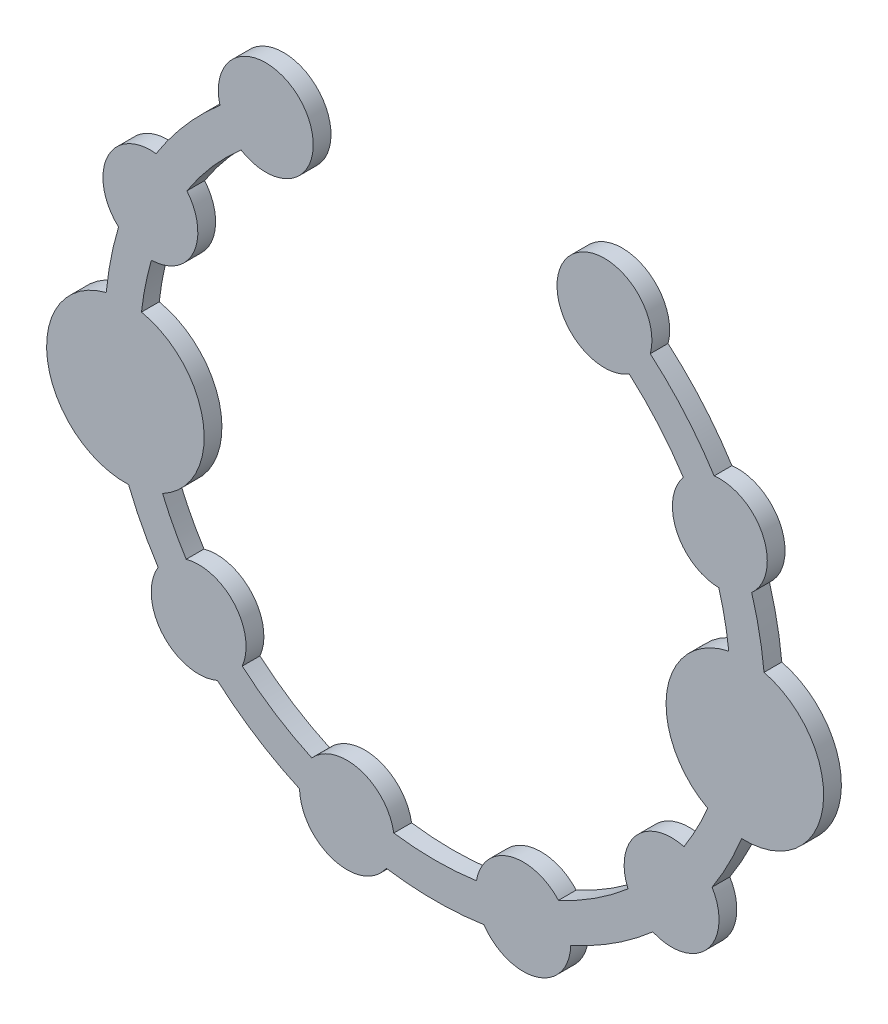
ISO-10303-21;
HEADER;
FILE_DESCRIPTION(('STEP AP214'),'2;1');
FILE_NAME('part.step','',(''),(''),'','','');
FILE_SCHEMA(('AUTOMOTIVE_DESIGN { 1 0 10303 214 1 1 1 1 }'));
ENDSEC;
DATA;
#1=APPLICATION_CONTEXT('core data for automotive mechanical design processes');
#2=APPLICATION_PROTOCOL_DEFINITION('international standard','automotive_design',2000,#1);
#3=PRODUCT_CONTEXT('',#1,'mechanical');
#4=PRODUCT('Part','Part','',(#3));
#5=PRODUCT_RELATED_PRODUCT_CATEGORY('part','',(#4));
#6=PRODUCT_DEFINITION_FORMATION('','',#4);
#7=PRODUCT_DEFINITION_CONTEXT('part definition',#1,'design');
#8=PRODUCT_DEFINITION('design','',#6,#7);
#9=PRODUCT_DEFINITION_SHAPE('','',#8);
#10=(LENGTH_UNIT() NAMED_UNIT(*) SI_UNIT(.MILLI.,.METRE.));
#11=(NAMED_UNIT(*) PLANE_ANGLE_UNIT() SI_UNIT($,.RADIAN.));
#12=(NAMED_UNIT(*) SI_UNIT($,.STERADIAN.) SOLID_ANGLE_UNIT());
#13=UNCERTAINTY_MEASURE_WITH_UNIT(LENGTH_MEASURE(1.E-05),#10,'distance_accuracy_value','');
#14=(GEOMETRIC_REPRESENTATION_CONTEXT(3) GLOBAL_UNCERTAINTY_ASSIGNED_CONTEXT((#13)) GLOBAL_UNIT_ASSIGNED_CONTEXT((#10,
#11,#12)) REPRESENTATION_CONTEXT('',''));
#15=CARTESIAN_POINT('',(0.,0.,0.));
#16=DIRECTION('',(0.,0.,1.));
#17=DIRECTION('',(1.,0.,0.));
#18=AXIS2_PLACEMENT_3D('',#15,#16,#17);
#19=CARTESIAN_POINT('',(0.,0.,0.));
#20=DIRECTION('',(0.,0.,1.));
#21=DIRECTION('',(1.,0.,0.));
#22=AXIS2_PLACEMENT_3D('',#19,#20,#21);
#23=CYLINDRICAL_SURFACE('',#22,33.75);
#24=DIRECTION('',(0.,0.,-1.));
#25=VECTOR('',#24,1.);
#26=CARTESIAN_POINT('',(28.3574490931425,18.3007535618026,1.015));
#27=LINE('',#26,#25);
#28=CARTESIAN_POINT('',(28.3574490931425,18.3007535618026,2.03));
#29=VERTEX_POINT('',#28);
#30=CARTESIAN_POINT('',(28.3574490931425,18.3007535618026,0.));
#31=VERTEX_POINT('',#30);
#32=EDGE_CURVE('E59',#29,#31,#27,.T.);
#33=ORIENTED_EDGE('',*,*,#32,.F.);
#34=CARTESIAN_POINT('',(0.,0.,2.03));
#35=DIRECTION('',(0.,0.,-1.));
#36=DIRECTION('',(-1.,0.,0.));
#37=AXIS2_PLACEMENT_3D('',#34,#35,#36);
#38=CIRCLE('',#37,33.75);
#39=CARTESIAN_POINT('',(22.1760107652679,25.4418365402092,2.03));
#40=VERTEX_POINT('',#39);
#41=EDGE_CURVE('E291',#40,#29,#38,.T.);
#42=ORIENTED_EDGE('',*,*,#41,.F.);
#43=DIRECTION('',(0.,0.,1.));
#44=VECTOR('',#43,1.);
#45=CARTESIAN_POINT('',(22.1760107652679,25.4418365402092,0.));
#46=LINE('',#45,#44);
#47=CARTESIAN_POINT('',(22.1760107652679,25.4418365402092,0.));
#48=VERTEX_POINT('',#47);
#49=EDGE_CURVE('E274',#48,#40,#46,.T.);
#50=ORIENTED_EDGE('',*,*,#49,.F.);
#51=CARTESIAN_POINT('',(0.,0.,0.));
#52=DIRECTION('',(0.,0.,-1.));
#53=DIRECTION('',(-1.,0.,0.));
#54=AXIS2_PLACEMENT_3D('',#51,#52,#53);
#55=CIRCLE('',#54,33.75);
#56=EDGE_CURVE('E283',#48,#31,#55,.T.);
#57=ORIENTED_EDGE('',*,*,#56,.T.);
#58=EDGE_LOOP('',(#33,#42,#50,#57));
#59=FACE_BOUND('',#58,.T.);
#60=ADVANCED_FACE('F36',(#59),#23,.F.);
#61=CARTESIAN_POINT('',(0.,0.,0.));
#62=DIRECTION('',(0.,0.,1.));
#63=DIRECTION('',(1.,0.,0.));
#64=AXIS2_PLACEMENT_3D('',#61,#62,#63);
#65=CYLINDRICAL_SURFACE('',#64,37.75);
#66=DIRECTION('',(0.,0.,-1.));
#67=VECTOR('',#66,1.);
#68=CARTESIAN_POINT('',(31.8794195866251,20.2179402219885,1.015));
#69=LINE('',#68,#67);
#70=CARTESIAN_POINT('',(31.8794195866251,20.2179402219885,0.));
#71=VERTEX_POINT('',#70);
#72=CARTESIAN_POINT('',(31.8794195866251,20.2179402219885,2.03));
#73=VERTEX_POINT('',#72);
#74=EDGE_CURVE('E514',#71,#73,#69,.F.);
#75=ORIENTED_EDGE('',*,*,#74,.F.);
#76=CARTESIAN_POINT('',(0.,0.,0.));
#77=DIRECTION('',(0.,0.,1.));
#78=DIRECTION('',(-1.,0.,0.));
#79=AXIS2_PLACEMENT_3D('',#76,#77,#78);
#80=CIRCLE('',#79,37.75);
#81=CARTESIAN_POINT('',(24.5781736222649,28.6526766881177,0.));
#82=VERTEX_POINT('',#81);
#83=EDGE_CURVE('E287',#71,#82,#80,.T.);
#84=ORIENTED_EDGE('',*,*,#83,.T.);
#85=DIRECTION('',(0.,0.,1.));
#86=VECTOR('',#85,1.);
#87=CARTESIAN_POINT('',(24.5781736222649,28.6526766881177,0.));
#88=LINE('',#87,#86);
#89=CARTESIAN_POINT('',(24.5781736222649,28.6526766881177,2.03));
#90=VERTEX_POINT('',#89);
#91=EDGE_CURVE('E277',#82,#90,#88,.T.);
#92=ORIENTED_EDGE('',*,*,#91,.T.);
#93=CARTESIAN_POINT('',(0.,0.,2.03));
#94=DIRECTION('',(0.,0.,1.));
#95=DIRECTION('',(-1.,0.,0.));
#96=AXIS2_PLACEMENT_3D('',#93,#94,#95);
#97=CIRCLE('',#96,37.75);
#98=EDGE_CURVE('E361',#73,#90,#97,.T.);
#99=ORIENTED_EDGE('',*,*,#98,.F.);
#100=EDGE_LOOP('',(#75,#84,#92,#99));
#101=FACE_BOUND('',#100,.T.);
#102=ADVANCED_FACE('F512',(#101),#65,.T.);
#103=DIRECTION('',(0.,0.,-1.));
#104=VECTOR('',#103,1.);
#105=CARTESIAN_POINT('',(28.4316785886476,-18.1852179704241,1.015));
#106=LINE('',#105,#104);
#107=CARTESIAN_POINT('',(28.4316785886476,-18.1852179704241,2.03));
#108=VERTEX_POINT('',#107);
#109=CARTESIAN_POINT('',(28.4316785886476,-18.1852179704241,0.));
#110=VERTEX_POINT('',#109);
#111=EDGE_CURVE('E469',#108,#110,#106,.T.);
#112=ORIENTED_EDGE('',*,*,#111,.F.);
#113=CARTESIAN_POINT('',(31.1327234183603,-13.0313480713195,2.03));
#114=VERTEX_POINT('',#113);
#115=EDGE_CURVE('E448',#114,#108,#38,.T.);
#116=ORIENTED_EDGE('',*,*,#115,.F.);
#117=DIRECTION('',(0.,0.,-1.));
#118=VECTOR('',#117,1.);
#119=CARTESIAN_POINT('',(31.1327234183603,-13.0313480713195,1.015));
#120=LINE('',#119,#118);
#121=CARTESIAN_POINT('',(31.1327234183603,-13.0313480713195,0.));
#122=VERTEX_POINT('',#121);
#123=EDGE_CURVE('E421',#122,#114,#120,.F.);
#124=ORIENTED_EDGE('',*,*,#123,.F.);
#125=EDGE_CURVE('E454',#122,#110,#55,.T.);
#126=ORIENTED_EDGE('',*,*,#125,.T.);
#127=EDGE_LOOP('',(#112,#116,#124,#126));
#128=FACE_BOUND('',#127,.T.);
#129=ADVANCED_FACE('F541',(#128),#23,.F.);
#130=DIRECTION('',(0.,0.,-1.));
#131=VECTOR('',#130,1.);
#132=CARTESIAN_POINT('',(31.6393033547216,-20.5916726670736,1.015));
#133=LINE('',#132,#131);
#134=CARTESIAN_POINT('',(31.6393033547216,-20.5916726670736,0.));
#135=VERTEX_POINT('',#134);
#136=CARTESIAN_POINT('',(31.6393033547216,-20.5916726670736,2.03));
#137=VERTEX_POINT('',#136);
#138=EDGE_CURVE('E507',#135,#137,#133,.F.);
#139=ORIENTED_EDGE('',*,*,#138,.F.);
#140=CARTESIAN_POINT('',(35.0212489647341,-14.0916507531982,0.));
#141=VERTEX_POINT('',#140);
#142=EDGE_CURVE('E506',#135,#141,#80,.T.);
#143=ORIENTED_EDGE('',*,*,#142,.T.);
#144=DIRECTION('',(0.,0.,-1.));
#145=VECTOR('',#144,1.);
#146=CARTESIAN_POINT('',(35.0212489647341,-14.0916507531982,1.015));
#147=LINE('',#146,#145);
#148=CARTESIAN_POINT('',(35.0212489647341,-14.0916507531982,2.03));
#149=VERTEX_POINT('',#148);
#150=EDGE_CURVE('E476',#149,#141,#147,.T.);
#151=ORIENTED_EDGE('',*,*,#150,.F.);
#152=EDGE_CURVE('E497',#137,#149,#97,.T.);
#153=ORIENTED_EDGE('',*,*,#152,.F.);
#154=EDGE_LOOP('',(#139,#143,#151,#153));
#155=FACE_BOUND('',#154,.T.);
#156=ADVANCED_FACE('F505',(#155),#65,.T.);
#157=DIRECTION('',(0.,0.,-1.));
#158=VECTOR('',#157,1.);
#159=CARTESIAN_POINT('',(32.4093475244958,9.41789217587783,1.015));
#160=LINE('',#159,#158);
#161=CARTESIAN_POINT('',(32.4093475244958,9.41789217587783,0.));
#162=VERTEX_POINT('',#161);
#163=CARTESIAN_POINT('',(32.4093475244958,9.41789217587785,2.03));
#164=VERTEX_POINT('',#163);
#165=EDGE_CURVE('E458',#162,#164,#160,.F.);
#166=ORIENTED_EDGE('',*,*,#165,.F.);
#167=CARTESIAN_POINT('',(33.5453464398064,3.71109582648645,0.));
#168=VERTEX_POINT('',#167);
#169=EDGE_CURVE('E288',#162,#168,#55,.T.);
#170=ORIENTED_EDGE('',*,*,#169,.T.);
#171=DIRECTION('',(0.,0.,-1.));
#172=VECTOR('',#171,1.);
#173=CARTESIAN_POINT('',(33.5453464398064,3.71109582648646,1.015));
#174=LINE('',#173,#172);
#175=CARTESIAN_POINT('',(33.5453464398064,3.71109582648645,2.03));
#176=VERTEX_POINT('',#175);
#177=EDGE_CURVE('E417',#176,#168,#174,.T.);
#178=ORIENTED_EDGE('',*,*,#177,.F.);
#179=EDGE_CURVE('E51',#164,#176,#38,.T.);
#180=ORIENTED_EDGE('',*,*,#179,.F.);
#181=EDGE_LOOP('',(#166,#170,#178,#180));
#182=FACE_BOUND('',#181,.T.);
#183=ADVANCED_FACE('F456',(#182),#23,.F.);
#184=DIRECTION('',(0.,0.,-1.));
#185=VECTOR('',#184,1.);
#186=CARTESIAN_POINT('',(36.1659087125497,10.8207923460126,1.015));
#187=LINE('',#186,#185);
#188=CARTESIAN_POINT('',(36.1659087125496,10.8207923460126,2.03));
#189=VERTEX_POINT('',#188);
#190=CARTESIAN_POINT('',(36.1659087125496,10.8207923460126,0.));
#191=VERTEX_POINT('',#190);
#192=EDGE_CURVE('E526',#189,#191,#187,.T.);
#193=ORIENTED_EDGE('',*,*,#192,.F.);
#194=CARTESIAN_POINT('',(37.5750307406949,3.63036703872107,2.03));
#195=VERTEX_POINT('',#194);
#196=EDGE_CURVE('E494',#195,#189,#97,.T.);
#197=ORIENTED_EDGE('',*,*,#196,.F.);
#198=DIRECTION('',(0.,0.,-1.));
#199=VECTOR('',#198,1.);
#200=CARTESIAN_POINT('',(37.5750307406949,3.63036703872105,1.015));
#201=LINE('',#200,#199);
#202=CARTESIAN_POINT('',(37.5750307406949,3.63036703872105,0.));
#203=VERTEX_POINT('',#202);
#204=EDGE_CURVE('E479',#203,#195,#201,.F.);
#205=ORIENTED_EDGE('',*,*,#204,.F.);
#206=EDGE_CURVE('E509',#203,#191,#80,.T.);
#207=ORIENTED_EDGE('',*,*,#206,.T.);
#208=EDGE_LOOP('',(#193,#197,#205,#207));
#209=FACE_BOUND('',#208,.T.);
#210=ADVANCED_FACE('F593',(#209),#65,.T.);
#211=DIRECTION('',(0.,0.,-1.));
#212=VECTOR('',#211,1.);
#213=CARTESIAN_POINT('',(22.0366357753982,-25.5626521257564,1.015));
#214=LINE('',#213,#212);
#215=CARTESIAN_POINT('',(22.0366357753982,-25.5626521257564,0.));
#216=VERTEX_POINT('',#215);
#217=CARTESIAN_POINT('',(22.0366357753982,-25.5626521257564,2.03));
#218=VERTEX_POINT('',#217);
#219=EDGE_CURVE('E451',#216,#218,#214,.F.);
#220=ORIENTED_EDGE('',*,*,#219,.F.);
#221=CARTESIAN_POINT('',(14.0904718331514,-30.6679165174155,0.));
#222=VERTEX_POINT('',#221);
#223=EDGE_CURVE('E450',#216,#222,#55,.T.);
#224=ORIENTED_EDGE('',*,*,#223,.T.);
#225=DIRECTION('',(0.,0.,-1.));
#226=VECTOR('',#225,1.);
#227=CARTESIAN_POINT('',(14.0904718331514,-30.6679165174155,1.015));
#228=LINE('',#227,#226);
#229=CARTESIAN_POINT('',(14.0904718331514,-30.6679165174155,2.03));
#230=VERTEX_POINT('',#229);
#231=EDGE_CURVE('E297',#230,#222,#228,.T.);
#232=ORIENTED_EDGE('',*,*,#231,.F.);
#233=EDGE_CURVE('E441',#218,#230,#38,.T.);
#234=ORIENTED_EDGE('',*,*,#233,.F.);
#235=EDGE_LOOP('',(#220,#224,#232,#234));
#236=FACE_BOUND('',#235,.T.);
#237=ADVANCED_FACE('F449',(#236),#23,.F.);
#238=DIRECTION('',(0.,0.,-1.));
#239=VECTOR('',#238,1.);
#240=CARTESIAN_POINT('',(24.8740100130373,-28.396234360762,1.015));
#241=LINE('',#240,#239);
#242=CARTESIAN_POINT('',(24.8740100130373,-28.396234360762,2.03));
#243=VERTEX_POINT('',#242);
#244=CARTESIAN_POINT('',(24.8740100130373,-28.396234360762,0.));
#245=VERTEX_POINT('',#244);
#246=EDGE_CURVE('E535',#243,#245,#241,.T.);
#247=ORIENTED_EDGE('',*,*,#246,.F.);
#248=CARTESIAN_POINT('',(15.4883469459396,-34.4263505019368,2.03));
#249=VERTEX_POINT('',#248);
#250=EDGE_CURVE('E504',#249,#243,#97,.T.);
#251=ORIENTED_EDGE('',*,*,#250,.F.);
#252=DIRECTION('',(0.,0.,-1.));
#253=VECTOR('',#252,1.);
#254=CARTESIAN_POINT('',(15.4883469459396,-34.4263505019368,1.015));
#255=LINE('',#254,#253);
#256=CARTESIAN_POINT('',(15.4883469459396,-34.4263505019368,0.));
#257=VERTEX_POINT('',#256);
#258=EDGE_CURVE('E11',#257,#249,#255,.F.);
#259=ORIENTED_EDGE('',*,*,#258,.F.);
#260=EDGE_CURVE('E414',#257,#245,#80,.T.);
#261=ORIENTED_EDGE('',*,*,#260,.T.);
#262=EDGE_LOOP('',(#247,#251,#259,#261));
#263=FACE_BOUND('',#262,.T.);
#264=ADVANCED_FACE('F596',(#263),#65,.T.);
#265=CARTESIAN_POINT('',(-36.1659087125496,10.8207923460126,2.03));
#266=VERTEX_POINT('',#265);
#267=CARTESIAN_POINT('',(-37.5750307406949,3.63036703872105,2.03));
#268=VERTEX_POINT('',#267);
#269=EDGE_CURVE('E367',#266,#268,#97,.T.);
#270=ORIENTED_EDGE('',*,*,#269,.F.);
#271=DIRECTION('',(0.,0.,-1.));
#272=VECTOR('',#271,1.);
#273=CARTESIAN_POINT('',(-36.1659087125497,10.8207923460126,1.015));
#274=LINE('',#273,#272);
#275=CARTESIAN_POINT('',(-36.1659087125497,10.8207923460126,0.));
#276=VERTEX_POINT('',#275);
#277=EDGE_CURVE('E319',#266,#276,#274,.T.);
#278=ORIENTED_EDGE('',*,*,#277,.T.);
#279=CARTESIAN_POINT('',(-37.5750307406949,3.63036703872105,0.));
#280=VERTEX_POINT('',#279);
#281=EDGE_CURVE('E358',#276,#280,#80,.T.);
#282=ORIENTED_EDGE('',*,*,#281,.T.);
#283=DIRECTION('',(0.,0.,-1.));
#284=VECTOR('',#283,1.);
#285=CARTESIAN_POINT('',(-37.5750307406949,3.63036703872105,1.015));
#286=LINE('',#285,#284);
#287=EDGE_CURVE('E348',#280,#268,#286,.F.);
#288=ORIENTED_EDGE('',*,*,#287,.T.);
#289=EDGE_LOOP('',(#270,#278,#282,#288));
#290=FACE_BOUND('',#289,.T.);
#291=ADVANCED_FACE('F584',(#290),#65,.T.);
#292=CARTESIAN_POINT('',(-24.5781736222649,28.6526766881177,0.));
#293=VERTEX_POINT('',#292);
#294=CARTESIAN_POINT('',(-31.8794195866251,20.2179402219885,0.));
#295=VERTEX_POINT('',#294);
#296=EDGE_CURVE('E355',#293,#295,#80,.T.);
#297=ORIENTED_EDGE('',*,*,#296,.T.);
#298=DIRECTION('',(0.,0.,-1.));
#299=VECTOR('',#298,1.);
#300=CARTESIAN_POINT('',(-31.8794195866251,20.2179402219885,1.015));
#301=LINE('',#300,#299);
#302=CARTESIAN_POINT('',(-31.8794195866251,20.2179402219885,2.03));
#303=VERTEX_POINT('',#302);
#304=EDGE_CURVE('E317',#295,#303,#301,.F.);
#305=ORIENTED_EDGE('',*,*,#304,.T.);
#306=CARTESIAN_POINT('',(-24.5781736222649,28.6526766881177,2.03));
#307=VERTEX_POINT('',#306);
#308=EDGE_CURVE('E363',#307,#303,#97,.T.);
#309=ORIENTED_EDGE('',*,*,#308,.F.);
#310=DIRECTION('',(0.,0.,1.));
#311=VECTOR('',#310,1.);
#312=CARTESIAN_POINT('',(-24.5781736222649,28.6526766881177,0.));
#313=LINE('',#312,#311);
#314=EDGE_CURVE('E369',#293,#307,#313,.T.);
#315=ORIENTED_EDGE('',*,*,#314,.F.);
#316=EDGE_LOOP('',(#297,#305,#309,#315));
#317=FACE_BOUND('',#316,.T.);
#318=ADVANCED_FACE('F641',(#317),#65,.T.);
#319=CARTESIAN_POINT('',(-33.5453464398064,3.71109582648646,0.));
#320=VERTEX_POINT('',#319);
#321=CARTESIAN_POINT('',(-32.4093475244958,9.41789217587785,0.));
#322=VERTEX_POINT('',#321);
#323=EDGE_CURVE('E559',#320,#322,#55,.T.);
#324=ORIENTED_EDGE('',*,*,#323,.T.);
#325=DIRECTION('',(0.,0.,-1.));
#326=VECTOR('',#325,1.);
#327=CARTESIAN_POINT('',(-32.4093475244958,9.41789217587783,1.015));
#328=LINE('',#327,#326);
#329=CARTESIAN_POINT('',(-32.4093475244958,9.41789217587785,2.03));
#330=VERTEX_POINT('',#329);
#331=EDGE_CURVE('E315',#322,#330,#328,.F.);
#332=ORIENTED_EDGE('',*,*,#331,.T.);
#333=CARTESIAN_POINT('',(-33.5453464398064,3.71109582648646,2.03));
#334=VERTEX_POINT('',#333);
#335=EDGE_CURVE('E544',#334,#330,#38,.T.);
#336=ORIENTED_EDGE('',*,*,#335,.F.);
#337=DIRECTION('',(0.,0.,-1.));
#338=VECTOR('',#337,1.);
#339=CARTESIAN_POINT('',(-33.5453464398064,3.71109582648646,1.015));
#340=LINE('',#339,#338);
#341=EDGE_CURVE('E390',#334,#320,#340,.T.);
#342=ORIENTED_EDGE('',*,*,#341,.T.);
#343=EDGE_LOOP('',(#324,#332,#336,#342));
#344=FACE_BOUND('',#343,.T.);
#345=ADVANCED_FACE('F558',(#344),#23,.F.);
#346=CARTESIAN_POINT('',(-28.3574490931425,18.3007535618026,2.03));
#347=VERTEX_POINT('',#346);
#348=CARTESIAN_POINT('',(-22.1760107652679,25.4418365402092,2.03));
#349=VERTEX_POINT('',#348);
#350=EDGE_CURVE('E353',#347,#349,#38,.T.);
#351=ORIENTED_EDGE('',*,*,#350,.F.);
#352=DIRECTION('',(0.,0.,-1.));
#353=VECTOR('',#352,1.);
#354=CARTESIAN_POINT('',(-28.3574490931425,18.3007535618026,1.015));
#355=LINE('',#354,#353);
#356=CARTESIAN_POINT('',(-28.3574490931425,18.3007535618026,0.));
#357=VERTEX_POINT('',#356);
#358=EDGE_CURVE('E312',#347,#357,#355,.T.);
#359=ORIENTED_EDGE('',*,*,#358,.T.);
#360=CARTESIAN_POINT('',(-22.1760107652679,25.4418365402092,0.));
#361=VERTEX_POINT('',#360);
#362=EDGE_CURVE('E366',#357,#361,#55,.T.);
#363=ORIENTED_EDGE('',*,*,#362,.T.);
#364=DIRECTION('',(0.,0.,1.));
#365=VECTOR('',#364,1.);
#366=CARTESIAN_POINT('',(-22.1760107652679,25.4418365402092,0.));
#367=LINE('',#366,#365);
#368=EDGE_CURVE('E357',#361,#349,#367,.T.);
#369=ORIENTED_EDGE('',*,*,#368,.T.);
#370=EDGE_LOOP('',(#351,#359,#363,#369));
#371=FACE_BOUND('',#370,.T.);
#372=ADVANCED_FACE('F567',(#371),#23,.F.);
#373=CARTESIAN_POINT('',(-24.8740100130373,-28.396234360762,2.03));
#374=VERTEX_POINT('',#373);
#375=CARTESIAN_POINT('',(-15.4883469459396,-34.4263505019368,2.03));
#376=VERTEX_POINT('',#375);
#377=EDGE_CURVE('E589',#374,#376,#97,.T.);
#378=ORIENTED_EDGE('',*,*,#377,.F.);
#379=DIRECTION('',(0.,0.,-1.));
#380=VECTOR('',#379,1.);
#381=CARTESIAN_POINT('',(-24.8740100130373,-28.396234360762,1.015));
#382=LINE('',#381,#380);
#383=CARTESIAN_POINT('',(-24.8740100130373,-28.396234360762,0.));
#384=VERTEX_POINT('',#383);
#385=EDGE_CURVE('E337',#374,#384,#382,.T.);
#386=ORIENTED_EDGE('',*,*,#385,.T.);
#387=CARTESIAN_POINT('',(-15.4883469459396,-34.4263505019368,0.));
#388=VERTEX_POINT('',#387);
#389=EDGE_CURVE('E651',#384,#388,#80,.T.);
#390=ORIENTED_EDGE('',*,*,#389,.T.);
#391=DIRECTION('',(0.,0.,1.));
#392=VECTOR('',#391,1.);
#393=CARTESIAN_POINT('',(-15.4883469459396,-34.4263505019368,1.015));
#394=LINE('',#393,#392);
#395=EDGE_CURVE('E372',#376,#388,#394,.F.);
#396=ORIENTED_EDGE('',*,*,#395,.F.);
#397=EDGE_LOOP('',(#378,#386,#390,#396));
#398=FACE_BOUND('',#397,.T.);
#399=ADVANCED_FACE('F633',(#398),#65,.T.);
#400=CARTESIAN_POINT('',(-35.0212489647341,-14.0916507531982,0.));
#401=VERTEX_POINT('',#400);
#402=CARTESIAN_POINT('',(-31.6393033547216,-20.5916726670736,0.));
#403=VERTEX_POINT('',#402);
#404=EDGE_CURVE('E650',#401,#403,#80,.T.);
#405=ORIENTED_EDGE('',*,*,#404,.T.);
#406=DIRECTION('',(0.,0.,-1.));
#407=VECTOR('',#406,1.);
#408=CARTESIAN_POINT('',(-31.6393033547216,-20.5916726670736,1.015));
#409=LINE('',#408,#407);
#410=CARTESIAN_POINT('',(-31.6393033547216,-20.5916726670736,2.03));
#411=VERTEX_POINT('',#410);
#412=EDGE_CURVE('E335',#403,#411,#409,.F.);
#413=ORIENTED_EDGE('',*,*,#412,.T.);
#414=CARTESIAN_POINT('',(-35.0212489647341,-14.0916507531982,2.03));
#415=VERTEX_POINT('',#414);
#416=EDGE_CURVE('E588',#415,#411,#97,.T.);
#417=ORIENTED_EDGE('',*,*,#416,.F.);
#418=DIRECTION('',(0.,0.,-1.));
#419=VECTOR('',#418,1.);
#420=CARTESIAN_POINT('',(-35.0212489647341,-14.0916507531982,1.015));
#421=LINE('',#420,#419);
#422=EDGE_CURVE('E351',#415,#401,#421,.T.);
#423=ORIENTED_EDGE('',*,*,#422,.T.);
#424=EDGE_LOOP('',(#405,#413,#417,#423));
#425=FACE_BOUND('',#424,.T.);
#426=ADVANCED_FACE('F620',(#425),#65,.T.);
#427=CARTESIAN_POINT('',(-14.0904718331514,-30.6679165174155,0.));
#428=VERTEX_POINT('',#427);
#429=CARTESIAN_POINT('',(-22.0366357753982,-25.5626521257564,0.));
#430=VERTEX_POINT('',#429);
#431=EDGE_CURVE('E290',#428,#430,#55,.T.);
#432=ORIENTED_EDGE('',*,*,#431,.T.);
#433=DIRECTION('',(0.,0.,-1.));
#434=VECTOR('',#433,1.);
#435=CARTESIAN_POINT('',(-22.0366357753982,-25.5626521257564,1.015));
#436=LINE('',#435,#434);
#437=CARTESIAN_POINT('',(-22.0366357753982,-25.5626521257564,2.03));
#438=VERTEX_POINT('',#437);
#439=EDGE_CURVE('E333',#430,#438,#436,.F.);
#440=ORIENTED_EDGE('',*,*,#439,.T.);
#441=CARTESIAN_POINT('',(-14.0904718331514,-30.6679165174155,2.03));
#442=VERTEX_POINT('',#441);
#443=EDGE_CURVE('E362',#442,#438,#38,.T.);
#444=ORIENTED_EDGE('',*,*,#443,.F.);
#445=DIRECTION('',(0.,0.,1.));
#446=VECTOR('',#445,1.);
#447=CARTESIAN_POINT('',(-14.0904718331514,-30.6679165174155,1.015));
#448=LINE('',#447,#446);
#449=EDGE_CURVE('E380',#428,#442,#448,.T.);
#450=ORIENTED_EDGE('',*,*,#449,.F.);
#451=EDGE_LOOP('',(#432,#440,#444,#450));
#452=FACE_BOUND('',#451,.T.);
#453=ADVANCED_FACE('F623',(#452),#23,.F.);
#454=CARTESIAN_POINT('',(-28.4316785886476,-18.1852179704241,2.03));
#455=VERTEX_POINT('',#454);
#456=CARTESIAN_POINT('',(-31.1327234183603,-13.0313480713195,2.03));
#457=VERTEX_POINT('',#456);
#458=EDGE_CURVE('E543',#455,#457,#38,.T.);
#459=ORIENTED_EDGE('',*,*,#458,.F.);
#460=DIRECTION('',(0.,0.,-1.));
#461=VECTOR('',#460,1.);
#462=CARTESIAN_POINT('',(-28.4316785886476,-18.1852179704241,1.015));
#463=LINE('',#462,#461);
#464=CARTESIAN_POINT('',(-28.4316785886476,-18.1852179704241,0.));
#465=VERTEX_POINT('',#464);
#466=EDGE_CURVE('E330',#455,#465,#463,.T.);
#467=ORIENTED_EDGE('',*,*,#466,.T.);
#468=CARTESIAN_POINT('',(-31.1327234183603,-13.0313480713195,0.));
#469=VERTEX_POINT('',#468);
#470=EDGE_CURVE('E552',#465,#469,#55,.T.);
#471=ORIENTED_EDGE('',*,*,#470,.T.);
#472=DIRECTION('',(0.,0.,-1.));
#473=VECTOR('',#472,1.);
#474=CARTESIAN_POINT('',(-31.1327234183603,-13.0313480713195,1.015));
#475=LINE('',#474,#473);
#476=EDGE_CURVE('E397',#469,#457,#475,.F.);
#477=ORIENTED_EDGE('',*,*,#476,.T.);
#478=EDGE_LOOP('',(#459,#467,#471,#477));
#479=FACE_BOUND('',#478,.T.);
#480=ADVANCED_FACE('F551',(#479),#23,.F.);
#481=CARTESIAN_POINT('',(-10.0697618662976,-34.3025129685284,2.03));
#482=DIRECTION('',(0.,0.,-1.));
#483=DIRECTION('',(-1.,0.,0.));
#484=AXIS2_PLACEMENT_3D('',#481,#482,#483);
#485=CYLINDRICAL_SURFACE('',#484,5.42000000000001);
#486=CARTESIAN_POINT('',(-10.0697618662976,-34.3025129685284,2.03));
#487=DIRECTION('',(0.,0.,1.));
#488=DIRECTION('',(1.,0.,0.));
#489=AXIS2_PLACEMENT_3D('',#486,#487,#488);
#490=CIRCLE('',#489,5.42000000000001);
#491=CARTESIAN_POINT('',(-4.72242643949602,-33.4179770261988,2.03));
#492=VERTEX_POINT('',#491);
#493=EDGE_CURVE('E387',#492,#442,#490,.T.);
#494=ORIENTED_EDGE('',*,*,#493,.F.);
#495=DIRECTION('',(0.,0.,1.));
#496=VECTOR('',#495,1.);
#497=CARTESIAN_POINT('',(-4.72242643949602,-33.4179770261988,1.015));
#498=LINE('',#497,#496);
#499=CARTESIAN_POINT('',(-4.72242643949602,-33.4179770261988,0.));
#500=VERTEX_POINT('',#499);
#501=EDGE_CURVE('E383',#492,#500,#498,.F.);
#502=ORIENTED_EDGE('',*,*,#501,.T.);
#503=CARTESIAN_POINT('',(-10.0697618662976,-34.3025129685284,0.));
#504=DIRECTION('',(0.,0.,1.));
#505=DIRECTION('',(1.,0.,0.));
#506=AXIS2_PLACEMENT_3D('',#503,#504,#505);
#507=CIRCLE('',#506,5.42000000000001);
#508=EDGE_CURVE('E392',#500,#428,#507,.T.);
#509=ORIENTED_EDGE('',*,*,#508,.T.);
#510=ORIENTED_EDGE('',*,*,#449,.T.);
#511=EDGE_LOOP('',(#494,#502,#509,#510));
#512=FACE_BOUND('',#511,.T.);
#513=ADVANCED_FACE('F622',(#512),#485,.T.);
#514=CARTESIAN_POINT('',(-5.5779246114737,-37.3356298598097,0.));
#515=VERTEX_POINT('',#514);
#516=EDGE_CURVE('E386',#388,#515,#507,.T.);
#517=ORIENTED_EDGE('',*,*,#516,.T.);
#518=DIRECTION('',(0.,0.,1.));
#519=VECTOR('',#518,1.);
#520=CARTESIAN_POINT('',(-5.5779246114737,-37.3356298598097,1.015));
#521=LINE('',#520,#519);
#522=CARTESIAN_POINT('',(-5.5779246114737,-37.3356298598097,2.03));
#523=VERTEX_POINT('',#522);
#524=EDGE_CURVE('E377',#515,#523,#521,.T.);
#525=ORIENTED_EDGE('',*,*,#524,.T.);
#526=EDGE_CURVE('E391',#376,#523,#490,.T.);
#527=ORIENTED_EDGE('',*,*,#526,.F.);
#528=ORIENTED_EDGE('',*,*,#395,.T.);
#529=EDGE_LOOP('',(#517,#525,#527,#528));
#530=FACE_BOUND('',#529,.T.);
#531=ADVANCED_FACE('F38',(#530),#485,.T.);
#532=CARTESIAN_POINT('',(-10.0697618662976,-34.3025129685284,2.03));
#533=DIRECTION('',(0.,0.,1.));
#534=DIRECTION('',(1.,0.,0.));
#535=AXIS2_PLACEMENT_3D('',#532,#533,#534);
#536=PLANE('',#535);
#537=ORIENTED_EDGE('',*,*,#98,.T.);
#538=CARTESIAN_POINT('',(19.3450847635356,30.0637688171596,2.03));
#539=DIRECTION('',(0.,0.,-1.));
#540=DIRECTION('',(-1.,0.,0.));
#541=AXIS2_PLACEMENT_3D('',#538,#539,#540);
#542=CIRCLE('',#541,5.42000000000001);
#543=EDGE_CURVE('E280',#40,#90,#542,.T.);
#544=ORIENTED_EDGE('',*,*,#543,.F.);
#545=ORIENTED_EDGE('',*,*,#41,.T.);
#546=CARTESIAN_POINT('',(32.5259384518665,14.8366380229955,2.03));
#547=DIRECTION('',(0.,0.,-1.));
#548=DIRECTION('',(-1.,0.,0.));
#549=AXIS2_PLACEMENT_3D('',#546,#547,#548);
#550=CIRCLE('',#549,5.42000000000001);
#551=EDGE_CURVE('E520',#164,#29,#550,.T.);
#552=ORIENTED_EDGE('',*,*,#551,.F.);
#553=ORIENTED_EDGE('',*,*,#179,.T.);
#554=CARTESIAN_POINT('',(35.3845002549535,-5.09898437997194,2.03));
#555=DIRECTION('',(0.,0.,-1.));
#556=DIRECTION('',(-1.,0.,0.));
#557=AXIS2_PLACEMENT_3D('',#554,#555,#556);
#558=CIRCLE('',#557,9.);
#559=EDGE_CURVE('E466',#114,#176,#558,.T.);
#560=ORIENTED_EDGE('',*,*,#559,.F.);
#561=ORIENTED_EDGE('',*,*,#115,.T.);
#562=CARTESIAN_POINT('',(27.0135892978425,-23.4164150383335,2.03));
#563=DIRECTION('',(0.,0.,-1.));
#564=DIRECTION('',(-1.,0.,0.));
#565=AXIS2_PLACEMENT_3D('',#562,#563,#564);
#566=CIRCLE('',#565,5.42000000000001);
#567=EDGE_CURVE('E444',#218,#108,#566,.T.);
#568=ORIENTED_EDGE('',*,*,#567,.F.);
#569=ORIENTED_EDGE('',*,*,#233,.T.);
#570=CARTESIAN_POINT('',(10.0697618662976,-34.3025129685284,2.03));
#571=DIRECTION('',(0.,0.,-1.));
#572=DIRECTION('',(-1.,0.,0.));
#573=AXIS2_PLACEMENT_3D('',#570,#571,#572);
#574=CIRCLE('',#573,5.42000000000001);
#575=CARTESIAN_POINT('',(4.72242643949602,-33.4179770261988,2.03));
#576=VERTEX_POINT('',#575);
#577=EDGE_CURVE('E424',#576,#230,#574,.T.);
#578=ORIENTED_EDGE('',*,*,#577,.F.);
#579=EDGE_CURVE('E438',#576,#492,#38,.T.);
#580=ORIENTED_EDGE('',*,*,#579,.T.);
#581=ORIENTED_EDGE('',*,*,#493,.T.);
#582=ORIENTED_EDGE('',*,*,#443,.T.);
#583=CARTESIAN_POINT('',(-27.0135892978425,-23.4164150383335,2.03));
#584=DIRECTION('',(0.,0.,1.));
#585=DIRECTION('',(1.,0.,0.));
#586=AXIS2_PLACEMENT_3D('',#583,#584,#585);
#587=CIRCLE('',#586,5.42000000000001);
#588=EDGE_CURVE('E323',#438,#455,#587,.T.);
#589=ORIENTED_EDGE('',*,*,#588,.T.);
#590=ORIENTED_EDGE('',*,*,#458,.T.);
#591=CARTESIAN_POINT('',(-35.3845002549535,-5.09898437997194,2.03));
#592=DIRECTION('',(0.,0.,1.));
#593=DIRECTION('',(1.,0.,0.));
#594=AXIS2_PLACEMENT_3D('',#591,#592,#593);
#595=CIRCLE('',#594,9.);
#596=EDGE_CURVE('E341',#457,#334,#595,.T.);
#597=ORIENTED_EDGE('',*,*,#596,.T.);
#598=ORIENTED_EDGE('',*,*,#335,.T.);
#599=CARTESIAN_POINT('',(-32.5259384518665,14.8366380229955,2.03));
#600=DIRECTION('',(0.,0.,1.));
#601=DIRECTION('',(1.,0.,0.));
#602=AXIS2_PLACEMENT_3D('',#599,#600,#601);
#603=CIRCLE('',#602,5.42000000000001);
#604=EDGE_CURVE('E305',#330,#347,#603,.T.);
#605=ORIENTED_EDGE('',*,*,#604,.T.);
#606=ORIENTED_EDGE('',*,*,#350,.T.);
#607=CARTESIAN_POINT('',(-19.3450847635356,30.0637688171596,2.03));
#608=DIRECTION('',(0.,0.,1.));
#609=DIRECTION('',(1.,0.,0.));
#610=AXIS2_PLACEMENT_3D('',#607,#608,#609);
#611=CIRCLE('',#610,5.42000000000001);
#612=EDGE_CURVE('E295',#349,#307,#611,.T.);
#613=ORIENTED_EDGE('',*,*,#612,.T.);
#614=ORIENTED_EDGE('',*,*,#308,.T.);
#615=EDGE_CURVE('E308',#303,#266,#603,.T.);
#616=ORIENTED_EDGE('',*,*,#615,.T.);
#617=ORIENTED_EDGE('',*,*,#269,.T.);
#618=EDGE_CURVE('E344',#268,#415,#595,.T.);
#619=ORIENTED_EDGE('',*,*,#618,.T.);
#620=ORIENTED_EDGE('',*,*,#416,.T.);
#621=EDGE_CURVE('E326',#411,#374,#587,.T.);
#622=ORIENTED_EDGE('',*,*,#621,.T.);
#623=ORIENTED_EDGE('',*,*,#377,.T.);
#624=ORIENTED_EDGE('',*,*,#526,.T.);
#625=CARTESIAN_POINT('',(5.5779246114737,-37.3356298598097,2.03));
#626=VERTEX_POINT('',#625);
#627=EDGE_CURVE('E368',#523,#626,#97,.T.);
#628=ORIENTED_EDGE('',*,*,#627,.T.);
#629=EDGE_CURVE('E407',#249,#626,#574,.T.);
#630=ORIENTED_EDGE('',*,*,#629,.F.);
#631=ORIENTED_EDGE('',*,*,#250,.T.);
#632=EDGE_CURVE('E500',#137,#243,#566,.T.);
#633=ORIENTED_EDGE('',*,*,#632,.F.);
#634=ORIENTED_EDGE('',*,*,#152,.T.);
#635=EDGE_CURVE('E480',#195,#149,#558,.T.);
#636=ORIENTED_EDGE('',*,*,#635,.F.);
#637=ORIENTED_EDGE('',*,*,#196,.T.);
#638=EDGE_CURVE('E523',#73,#189,#550,.T.);
#639=ORIENTED_EDGE('',*,*,#638,.F.);
#640=EDGE_LOOP('',(#537,#544,#545,#552,#553,#560,#561,#568,#569,#578,#580,#581,#582,#589,#590,
#597,#598,#605,#606,#613,#614,#616,#617,#619,#620,#622,#623,#624,#628,#630,#631,#633,#634,#636,
#637,#639));
#641=FACE_BOUND('',#640,.T.);
#642=ADVANCED_FACE('F437',(#641),#536,.T.);
#643=CARTESIAN_POINT('',(-10.0697618662976,-34.3025129685284,0.));
#644=DIRECTION('',(0.,0.,1.));
#645=DIRECTION('',(1.,0.,0.));
#646=AXIS2_PLACEMENT_3D('',#643,#644,#645);
#647=PLANE('',#646);
#648=ORIENTED_EDGE('',*,*,#56,.F.);
#649=CARTESIAN_POINT('',(19.3450847635356,30.0637688171596,0.));
#650=DIRECTION('',(0.,0.,-1.));
#651=DIRECTION('',(-1.,0.,0.));
#652=AXIS2_PLACEMENT_3D('',#649,#650,#651);
#653=CIRCLE('',#652,5.42000000000001);
#654=EDGE_CURVE('E270',#48,#82,#653,.T.);
#655=ORIENTED_EDGE('',*,*,#654,.T.);
#656=ORIENTED_EDGE('',*,*,#83,.F.);
#657=CARTESIAN_POINT('',(32.5259384518665,14.8366380229955,0.));
#658=DIRECTION('',(0.,0.,-1.));
#659=DIRECTION('',(-1.,0.,0.));
#660=AXIS2_PLACEMENT_3D('',#657,#658,#659);
#661=CIRCLE('',#660,5.42000000000001);
#662=EDGE_CURVE('E517',#71,#191,#661,.T.);
#663=ORIENTED_EDGE('',*,*,#662,.T.);
#664=ORIENTED_EDGE('',*,*,#206,.F.);
#665=CARTESIAN_POINT('',(35.3845002549535,-5.09898437997194,0.));
#666=DIRECTION('',(0.,0.,-1.));
#667=DIRECTION('',(-1.,0.,0.));
#668=AXIS2_PLACEMENT_3D('',#665,#666,#667);
#669=CIRCLE('',#668,9.);
#670=EDGE_CURVE('E468',#203,#141,#669,.T.);
#671=ORIENTED_EDGE('',*,*,#670,.T.);
#672=ORIENTED_EDGE('',*,*,#142,.F.);
#673=CARTESIAN_POINT('',(27.0135892978425,-23.4164150383335,0.));
#674=DIRECTION('',(0.,0.,-1.));
#675=DIRECTION('',(-1.,0.,0.));
#676=AXIS2_PLACEMENT_3D('',#673,#674,#675);
#677=CIRCLE('',#676,5.42000000000001);
#678=EDGE_CURVE('E533',#135,#245,#677,.T.);
#679=ORIENTED_EDGE('',*,*,#678,.T.);
#680=ORIENTED_EDGE('',*,*,#260,.F.);
#681=CARTESIAN_POINT('',(10.0697618662976,-34.3025129685284,0.));
#682=DIRECTION('',(0.,0.,-1.));
#683=DIRECTION('',(-1.,0.,0.));
#684=AXIS2_PLACEMENT_3D('',#681,#682,#683);
#685=CIRCLE('',#684,5.42000000000001);
#686=CARTESIAN_POINT('',(5.5779246114737,-37.3356298598097,0.));
#687=VERTEX_POINT('',#686);
#688=EDGE_CURVE('E405',#257,#687,#685,.T.);
#689=ORIENTED_EDGE('',*,*,#688,.T.);
#690=EDGE_CURVE('E359',#515,#687,#80,.T.);
#691=ORIENTED_EDGE('',*,*,#690,.F.);
#692=ORIENTED_EDGE('',*,*,#516,.F.);
#693=ORIENTED_EDGE('',*,*,#389,.F.);
#694=CARTESIAN_POINT('',(-27.0135892978425,-23.4164150383335,0.));
#695=DIRECTION('',(0.,0.,1.));
#696=DIRECTION('',(1.,0.,0.));
#697=AXIS2_PLACEMENT_3D('',#694,#695,#696);
#698=CIRCLE('',#697,5.42000000000001);
#699=EDGE_CURVE('E327',#403,#384,#698,.T.);
#700=ORIENTED_EDGE('',*,*,#699,.F.);
#701=ORIENTED_EDGE('',*,*,#404,.F.);
#702=CARTESIAN_POINT('',(-35.3845002549535,-5.09898437997194,0.));
#703=DIRECTION('',(0.,0.,1.));
#704=DIRECTION('',(1.,0.,0.));
#705=AXIS2_PLACEMENT_3D('',#702,#703,#704);
#706=CIRCLE('',#705,9.);
#707=EDGE_CURVE('E345',#280,#401,#706,.T.);
#708=ORIENTED_EDGE('',*,*,#707,.F.);
#709=ORIENTED_EDGE('',*,*,#281,.F.);
#710=CARTESIAN_POINT('',(-32.5259384518665,14.8366380229955,0.));
#711=DIRECTION('',(0.,0.,1.));
#712=DIRECTION('',(1.,0.,0.));
#713=AXIS2_PLACEMENT_3D('',#710,#711,#712);
#714=CIRCLE('',#713,5.42000000000001);
#715=EDGE_CURVE('E309',#295,#276,#714,.T.);
#716=ORIENTED_EDGE('',*,*,#715,.F.);
#717=ORIENTED_EDGE('',*,*,#296,.F.);
#718=CARTESIAN_POINT('',(-19.3450847635356,30.0637688171596,0.));
#719=DIRECTION('',(0.,0.,1.));
#720=DIRECTION('',(1.,0.,0.));
#721=AXIS2_PLACEMENT_3D('',#718,#719,#720);
#722=CIRCLE('',#721,5.42000000000001);
#723=EDGE_CURVE('E292',#361,#293,#722,.T.);
#724=ORIENTED_EDGE('',*,*,#723,.F.);
#725=ORIENTED_EDGE('',*,*,#362,.F.);
#726=EDGE_CURVE('E303',#322,#357,#714,.T.);
#727=ORIENTED_EDGE('',*,*,#726,.F.);
#728=ORIENTED_EDGE('',*,*,#323,.F.);
#729=EDGE_CURVE('E340',#469,#320,#706,.T.);
#730=ORIENTED_EDGE('',*,*,#729,.F.);
#731=ORIENTED_EDGE('',*,*,#470,.F.);
#732=EDGE_CURVE('E322',#430,#465,#698,.T.);
#733=ORIENTED_EDGE('',*,*,#732,.F.);
#734=ORIENTED_EDGE('',*,*,#431,.F.);
#735=ORIENTED_EDGE('',*,*,#508,.F.);
#736=CARTESIAN_POINT('',(4.72242643949602,-33.4179770261988,0.));
#737=VERTEX_POINT('',#736);
#738=EDGE_CURVE('E455',#737,#500,#55,.T.);
#739=ORIENTED_EDGE('',*,*,#738,.F.);
#740=EDGE_CURVE('E416',#737,#222,#685,.T.);
#741=ORIENTED_EDGE('',*,*,#740,.T.);
#742=ORIENTED_EDGE('',*,*,#223,.F.);
#743=EDGE_CURVE('E531',#216,#110,#677,.T.);
#744=ORIENTED_EDGE('',*,*,#743,.T.);
#745=ORIENTED_EDGE('',*,*,#125,.F.);
#746=EDGE_CURVE('E464',#122,#168,#669,.T.);
#747=ORIENTED_EDGE('',*,*,#746,.T.);
#748=ORIENTED_EDGE('',*,*,#169,.F.);
#749=EDGE_CURVE('E286',#162,#31,#661,.T.);
#750=ORIENTED_EDGE('',*,*,#749,.T.);
#751=EDGE_LOOP('',(#648,#655,#656,#663,#664,#671,#672,#679,#680,#689,#691,#692,#693,#700,#701,
#708,#709,#716,#717,#724,#725,#727,#728,#730,#731,#733,#734,#735,#739,#741,#742,#744,#745,#747,
#748,#750));
#752=FACE_BOUND('',#751,.T.);
#753=ADVANCED_FACE('F284',(#752),#647,.F.);
#754=DIRECTION('',(0.,0.,-1.));
#755=VECTOR('',#754,1.);
#756=CARTESIAN_POINT('',(4.72242643949602,-33.4179770261988,1.015));
#757=LINE('',#756,#755);
#758=EDGE_CURVE('E425',#737,#576,#757,.F.);
#759=ORIENTED_EDGE('',*,*,#758,.F.);
#760=ORIENTED_EDGE('',*,*,#738,.T.);
#761=ORIENTED_EDGE('',*,*,#501,.F.);
#762=ORIENTED_EDGE('',*,*,#579,.F.);
#763=EDGE_LOOP('',(#759,#760,#761,#762));
#764=FACE_BOUND('',#763,.T.);
#765=ADVANCED_FACE('F608',(#764),#23,.F.);
#766=DIRECTION('',(0.,0.,-1.));
#767=VECTOR('',#766,1.);
#768=CARTESIAN_POINT('',(5.5779246114737,-37.3356298598097,1.015));
#769=LINE('',#768,#767);
#770=EDGE_CURVE('E44',#626,#687,#769,.T.);
#771=ORIENTED_EDGE('',*,*,#770,.F.);
#772=ORIENTED_EDGE('',*,*,#627,.F.);
#773=ORIENTED_EDGE('',*,*,#524,.F.);
#774=ORIENTED_EDGE('',*,*,#690,.T.);
#775=EDGE_LOOP('',(#771,#772,#773,#774));
#776=FACE_BOUND('',#775,.T.);
#777=ADVANCED_FACE('F602',(#776),#65,.T.);
#778=CARTESIAN_POINT('',(-35.3845002549535,-5.09898437997194,2.03));
#779=DIRECTION('',(0.,0.,-1.));
#780=DIRECTION('',(-1.,0.,0.));
#781=AXIS2_PLACEMENT_3D('',#778,#779,#780);
#782=CYLINDRICAL_SURFACE('',#781,9.);
#783=ORIENTED_EDGE('',*,*,#476,.F.);
#784=ORIENTED_EDGE('',*,*,#729,.T.);
#785=ORIENTED_EDGE('',*,*,#341,.F.);
#786=ORIENTED_EDGE('',*,*,#596,.F.);
#787=EDGE_LOOP('',(#783,#784,#785,#786));
#788=FACE_BOUND('',#787,.T.);
#789=ADVANCED_FACE('F556',(#788),#782,.T.);
#790=ORIENTED_EDGE('',*,*,#422,.F.);
#791=ORIENTED_EDGE('',*,*,#618,.F.);
#792=ORIENTED_EDGE('',*,*,#287,.F.);
#793=ORIENTED_EDGE('',*,*,#707,.T.);
#794=EDGE_LOOP('',(#790,#791,#792,#793));
#795=FACE_BOUND('',#794,.T.);
#796=ADVANCED_FACE('F666',(#795),#782,.T.);
#797=CARTESIAN_POINT('',(-27.0135892978425,-23.4164150383335,2.03));
#798=DIRECTION('',(0.,0.,-1.));
#799=DIRECTION('',(-1.,0.,0.));
#800=AXIS2_PLACEMENT_3D('',#797,#798,#799);
#801=CYLINDRICAL_SURFACE('',#800,5.42000000000001);
#802=ORIENTED_EDGE('',*,*,#439,.F.);
#803=ORIENTED_EDGE('',*,*,#732,.T.);
#804=ORIENTED_EDGE('',*,*,#466,.F.);
#805=ORIENTED_EDGE('',*,*,#588,.F.);
#806=EDGE_LOOP('',(#802,#803,#804,#805));
#807=FACE_BOUND('',#806,.T.);
#808=ADVANCED_FACE('F668',(#807),#801,.T.);
#809=ORIENTED_EDGE('',*,*,#385,.F.);
#810=ORIENTED_EDGE('',*,*,#621,.F.);
#811=ORIENTED_EDGE('',*,*,#412,.F.);
#812=ORIENTED_EDGE('',*,*,#699,.T.);
#813=EDGE_LOOP('',(#809,#810,#811,#812));
#814=FACE_BOUND('',#813,.T.);
#815=ADVANCED_FACE('F663',(#814),#801,.T.);
#816=CARTESIAN_POINT('',(-32.5259384518665,14.8366380229955,2.03));
#817=DIRECTION('',(0.,0.,-1.));
#818=DIRECTION('',(-1.,0.,0.));
#819=AXIS2_PLACEMENT_3D('',#816,#817,#818);
#820=CYLINDRICAL_SURFACE('',#819,5.42000000000001);
#821=ORIENTED_EDGE('',*,*,#331,.F.);
#822=ORIENTED_EDGE('',*,*,#726,.T.);
#823=ORIENTED_EDGE('',*,*,#358,.F.);
#824=ORIENTED_EDGE('',*,*,#604,.F.);
#825=EDGE_LOOP('',(#821,#822,#823,#824));
#826=FACE_BOUND('',#825,.T.);
#827=ADVANCED_FACE('F564',(#826),#820,.T.);
#828=ORIENTED_EDGE('',*,*,#277,.F.);
#829=ORIENTED_EDGE('',*,*,#615,.F.);
#830=ORIENTED_EDGE('',*,*,#304,.F.);
#831=ORIENTED_EDGE('',*,*,#715,.T.);
#832=EDGE_LOOP('',(#828,#829,#830,#831));
#833=FACE_BOUND('',#832,.T.);
#834=ADVANCED_FACE('F580',(#833),#820,.T.);
#835=CARTESIAN_POINT('',(-19.3450847635356,30.0637688171596,2.03));
#836=DIRECTION('',(0.,0.,-1.));
#837=DIRECTION('',(-1.,0.,0.));
#838=AXIS2_PLACEMENT_3D('',#835,#836,#837);
#839=CYLINDRICAL_SURFACE('',#838,5.42000000000001);
#840=ORIENTED_EDGE('',*,*,#368,.F.);
#841=ORIENTED_EDGE('',*,*,#723,.T.);
#842=ORIENTED_EDGE('',*,*,#314,.T.);
#843=ORIENTED_EDGE('',*,*,#612,.F.);
#844=EDGE_LOOP('',(#840,#841,#842,#843));
#845=FACE_BOUND('',#844,.T.);
#846=ADVANCED_FACE('F572',(#845),#839,.T.);
#847=CARTESIAN_POINT('',(10.0697618662976,-34.3025129685284,2.03));
#848=DIRECTION('',(0.,0.,-1.));
#849=DIRECTION('',(-1.,0.,0.));
#850=AXIS2_PLACEMENT_3D('',#847,#848,#849);
#851=CYLINDRICAL_SURFACE('',#850,5.42000000000001);
#852=ORIENTED_EDGE('',*,*,#688,.F.);
#853=ORIENTED_EDGE('',*,*,#258,.T.);
#854=ORIENTED_EDGE('',*,*,#629,.T.);
#855=ORIENTED_EDGE('',*,*,#770,.T.);
#856=EDGE_LOOP('',(#852,#853,#854,#855));
#857=FACE_BOUND('',#856,.T.);
#858=ADVANCED_FACE('F404',(#857),#851,.T.);
#859=ORIENTED_EDGE('',*,*,#577,.T.);
#860=ORIENTED_EDGE('',*,*,#231,.T.);
#861=ORIENTED_EDGE('',*,*,#740,.F.);
#862=ORIENTED_EDGE('',*,*,#758,.T.);
#863=EDGE_LOOP('',(#859,#860,#861,#862));
#864=FACE_BOUND('',#863,.T.);
#865=ADVANCED_FACE('F433',(#864),#851,.T.);
#866=CARTESIAN_POINT('',(35.3845002549535,-5.09898437997194,2.03));
#867=DIRECTION('',(0.,0.,-1.));
#868=DIRECTION('',(-1.,0.,0.));
#869=AXIS2_PLACEMENT_3D('',#866,#867,#868);
#870=CYLINDRICAL_SURFACE('',#869,9.);
#871=ORIENTED_EDGE('',*,*,#670,.F.);
#872=ORIENTED_EDGE('',*,*,#204,.T.);
#873=ORIENTED_EDGE('',*,*,#635,.T.);
#874=ORIENTED_EDGE('',*,*,#150,.T.);
#875=EDGE_LOOP('',(#871,#872,#873,#874));
#876=FACE_BOUND('',#875,.T.);
#877=ADVANCED_FACE('F489',(#876),#870,.T.);
#878=ORIENTED_EDGE('',*,*,#559,.T.);
#879=ORIENTED_EDGE('',*,*,#177,.T.);
#880=ORIENTED_EDGE('',*,*,#746,.F.);
#881=ORIENTED_EDGE('',*,*,#123,.T.);
#882=EDGE_LOOP('',(#878,#879,#880,#881));
#883=FACE_BOUND('',#882,.T.);
#884=ADVANCED_FACE('F462',(#883),#870,.T.);
#885=CARTESIAN_POINT('',(27.0135892978425,-23.4164150383335,2.03));
#886=DIRECTION('',(0.,0.,-1.));
#887=DIRECTION('',(-1.,0.,0.));
#888=AXIS2_PLACEMENT_3D('',#885,#886,#887);
#889=CYLINDRICAL_SURFACE('',#888,5.42000000000001);
#890=ORIENTED_EDGE('',*,*,#678,.F.);
#891=ORIENTED_EDGE('',*,*,#138,.T.);
#892=ORIENTED_EDGE('',*,*,#632,.T.);
#893=ORIENTED_EDGE('',*,*,#246,.T.);
#894=EDGE_LOOP('',(#890,#891,#892,#893));
#895=FACE_BOUND('',#894,.T.);
#896=ADVANCED_FACE('F684',(#895),#889,.T.);
#897=ORIENTED_EDGE('',*,*,#567,.T.);
#898=ORIENTED_EDGE('',*,*,#111,.T.);
#899=ORIENTED_EDGE('',*,*,#743,.F.);
#900=ORIENTED_EDGE('',*,*,#219,.T.);
#901=EDGE_LOOP('',(#897,#898,#899,#900));
#902=FACE_BOUND('',#901,.T.);
#903=ADVANCED_FACE('F540',(#902),#889,.T.);
#904=CARTESIAN_POINT('',(32.5259384518665,14.8366380229955,2.03));
#905=DIRECTION('',(0.,0.,-1.));
#906=DIRECTION('',(-1.,0.,0.));
#907=AXIS2_PLACEMENT_3D('',#904,#905,#906);
#908=CYLINDRICAL_SURFACE('',#907,5.42000000000001);
#909=ORIENTED_EDGE('',*,*,#662,.F.);
#910=ORIENTED_EDGE('',*,*,#74,.T.);
#911=ORIENTED_EDGE('',*,*,#638,.T.);
#912=ORIENTED_EDGE('',*,*,#192,.T.);
#913=EDGE_LOOP('',(#909,#910,#911,#912));
#914=FACE_BOUND('',#913,.T.);
#915=ADVANCED_FACE('F591',(#914),#908,.T.);
#916=ORIENTED_EDGE('',*,*,#551,.T.);
#917=ORIENTED_EDGE('',*,*,#32,.T.);
#918=ORIENTED_EDGE('',*,*,#749,.F.);
#919=ORIENTED_EDGE('',*,*,#165,.T.);
#920=EDGE_LOOP('',(#916,#917,#918,#919));
#921=FACE_BOUND('',#920,.T.);
#922=ADVANCED_FACE('F690',(#921),#908,.T.);
#923=CARTESIAN_POINT('',(19.3450847635356,30.0637688171596,2.03));
#924=DIRECTION('',(0.,0.,-1.));
#925=DIRECTION('',(-1.,0.,0.));
#926=AXIS2_PLACEMENT_3D('',#923,#924,#925);
#927=CYLINDRICAL_SURFACE('',#926,5.42000000000001);
#928=ORIENTED_EDGE('',*,*,#49,.T.);
#929=ORIENTED_EDGE('',*,*,#543,.T.);
#930=ORIENTED_EDGE('',*,*,#91,.F.);
#931=ORIENTED_EDGE('',*,*,#654,.F.);
#932=EDGE_LOOP('',(#928,#929,#930,#931));
#933=FACE_BOUND('',#932,.T.);
#934=ADVANCED_FACE('F272',(#933),#927,.T.);
#935=CLOSED_SHELL('',(#60,#102,#129,#156,#183,#210,#237,#264,#291,#318,#345,#372,#399,#426,#453,
#480,#513,#531,#642,#753,#765,#777,#789,#796,#808,#815,#827,#834,#846,#858,#865,#877,#884,#896,
#903,#915,#922,#934));
#936=MANIFOLD_SOLID_BREP('B2',#935);
#937=ADVANCED_BREP_SHAPE_REPRESENTATION('',(#18,#936),#14);
#938=SHAPE_DEFINITION_REPRESENTATION(#9,#937);
ENDSEC;
END-ISO-10303-21;
